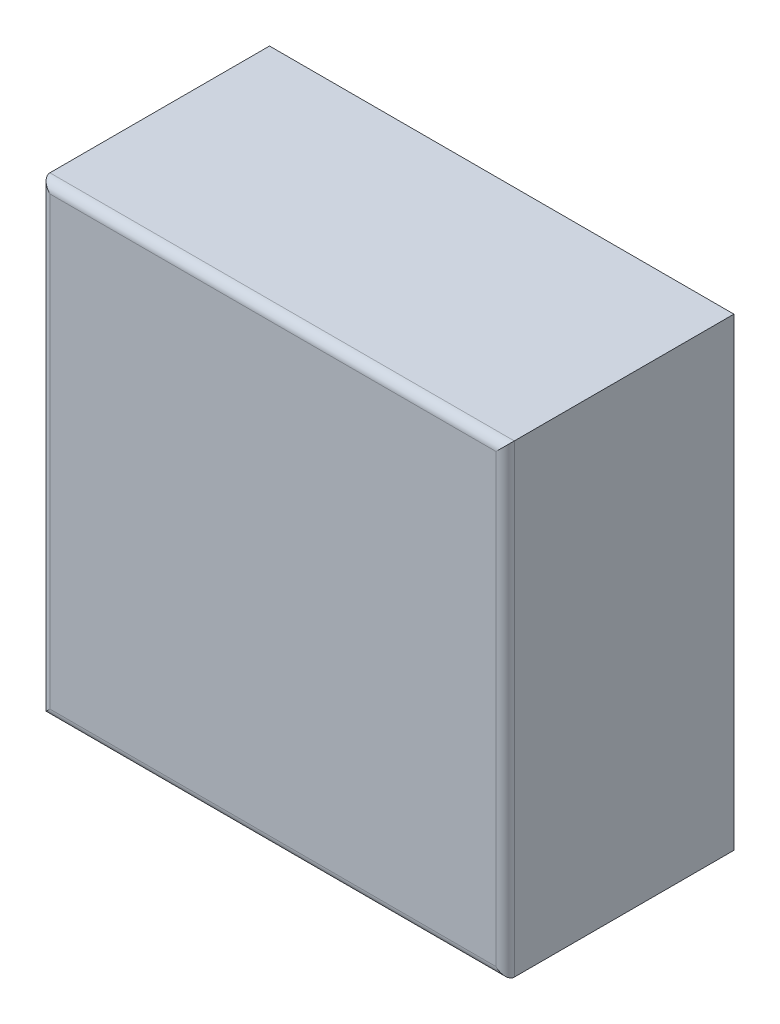
ISO-10303-21;
HEADER;
FILE_DESCRIPTION(('STEP AP214'),'2;1');
FILE_NAME('part.step','',(''),(''),'','','');
FILE_SCHEMA(('AUTOMOTIVE_DESIGN { 1 0 10303 214 1 1 1 1 }'));
ENDSEC;
DATA;
#1=APPLICATION_CONTEXT('core data for automotive mechanical design processes');
#2=APPLICATION_PROTOCOL_DEFINITION('international standard','automotive_design',2000,#1);
#3=PRODUCT_CONTEXT('',#1,'mechanical');
#4=PRODUCT('Part','Part','',(#3));
#5=PRODUCT_RELATED_PRODUCT_CATEGORY('part','',(#4));
#6=PRODUCT_DEFINITION_FORMATION('','',#4);
#7=PRODUCT_DEFINITION_CONTEXT('part definition',#1,'design');
#8=PRODUCT_DEFINITION('design','',#6,#7);
#9=PRODUCT_DEFINITION_SHAPE('','',#8);
#10=(LENGTH_UNIT() NAMED_UNIT(*) SI_UNIT(.MILLI.,.METRE.));
#11=(NAMED_UNIT(*) PLANE_ANGLE_UNIT() SI_UNIT($,.RADIAN.));
#12=(NAMED_UNIT(*) SI_UNIT($,.STERADIAN.) SOLID_ANGLE_UNIT());
#13=UNCERTAINTY_MEASURE_WITH_UNIT(LENGTH_MEASURE(1.E-05),#10,'distance_accuracy_value','');
#14=(GEOMETRIC_REPRESENTATION_CONTEXT(3) GLOBAL_UNCERTAINTY_ASSIGNED_CONTEXT((#13)) GLOBAL_UNIT_ASSIGNED_CONTEXT((#10,
#11,#12)) REPRESENTATION_CONTEXT('',''));
#15=CARTESIAN_POINT('',(0.,0.,0.));
#16=DIRECTION('',(0.,0.,1.));
#17=DIRECTION('',(1.,0.,0.));
#18=AXIS2_PLACEMENT_3D('',#15,#16,#17);
#19=CARTESIAN_POINT('',(-5.075,5.075,5.));
#20=DIRECTION('',(0.,0.,1.));
#21=DIRECTION('',(1.,0.,0.));
#22=AXIS2_PLACEMENT_3D('',#19,#20,#21);
#23=PLANE('',#22);
#24=DIRECTION('',(-1.,0.,0.));
#25=VECTOR('',#24,1.);
#26=CARTESIAN_POINT('',(5.075,-4.875,5.));
#27=LINE('',#26,#25);
#28=CARTESIAN_POINT('',(4.875,-4.875,5.));
#29=VERTEX_POINT('',#28);
#30=CARTESIAN_POINT('',(-4.875,-4.875,5.));
#31=VERTEX_POINT('',#30);
#32=EDGE_CURVE('E68',#29,#31,#27,.T.);
#33=ORIENTED_EDGE('',*,*,#32,.F.);
#34=DIRECTION('',(0.,-1.,0.));
#35=VECTOR('',#34,1.);
#36=CARTESIAN_POINT('',(4.875,5.075,5.));
#37=LINE('',#36,#35);
#38=CARTESIAN_POINT('',(4.875,4.875,5.));
#39=VERTEX_POINT('',#38);
#40=EDGE_CURVE('E89',#39,#29,#37,.T.);
#41=ORIENTED_EDGE('',*,*,#40,.F.);
#42=DIRECTION('',(1.,0.,0.));
#43=VECTOR('',#42,1.);
#44=CARTESIAN_POINT('',(-5.075,4.875,5.));
#45=LINE('',#44,#43);
#46=CARTESIAN_POINT('',(-4.875,4.875,5.));
#47=VERTEX_POINT('',#46);
#48=EDGE_CURVE('E80',#47,#39,#45,.T.);
#49=ORIENTED_EDGE('',*,*,#48,.F.);
#50=DIRECTION('',(0.,1.,0.));
#51=VECTOR('',#50,1.);
#52=CARTESIAN_POINT('',(-4.875,-5.075,5.));
#53=LINE('',#52,#51);
#54=EDGE_CURVE('E77',#31,#47,#53,.T.);
#55=ORIENTED_EDGE('',*,*,#54,.F.);
#56=EDGE_LOOP('',(#33,#41,#49,#55));
#57=FACE_BOUND('',#56,.T.);
#58=ADVANCED_FACE('F17',(#57),#23,.T.);
#59=CARTESIAN_POINT('',(-4.875,-5.075,4.8));
#60=DIRECTION('',(0.,1.,0.));
#61=DIRECTION('',(0.,0.,1.));
#62=AXIS2_PLACEMENT_3D('',#59,#60,#61);
#63=CYLINDRICAL_SURFACE('',#62,0.2);
#64=CARTESIAN_POINT('',(-4.875,4.875,4.8));
#65=DIRECTION('',(0.707106781186547,0.707106781186547,0.));
#66=DIRECTION('',(0.707106781186547,-0.707106781186547,0.));
#67=AXIS2_PLACEMENT_3D('',#64,#65,#66);
#68=ELLIPSE('',#67,0.282842712474619,0.2);
#69=CARTESIAN_POINT('',(-5.075,5.075,4.8));
#70=VERTEX_POINT('',#69);
#71=EDGE_CURVE('E93',#70,#47,#68,.T.);
#72=ORIENTED_EDGE('',*,*,#71,.F.);
#73=DIRECTION('',(0.,1.,0.));
#74=VECTOR('',#73,1.);
#75=CARTESIAN_POINT('',(-5.075,-5.075,4.8));
#76=LINE('',#75,#74);
#77=CARTESIAN_POINT('',(-5.075,-5.075,4.8));
#78=VERTEX_POINT('',#77);
#79=EDGE_CURVE('E87',#78,#70,#76,.T.);
#80=ORIENTED_EDGE('',*,*,#79,.F.);
#81=CARTESIAN_POINT('',(-4.875,-4.875,4.8));
#82=DIRECTION('',(-0.707106781186547,0.707106781186547,0.));
#83=DIRECTION('',(-0.707106781186547,-0.707106781186547,0.));
#84=AXIS2_PLACEMENT_3D('',#81,#82,#83);
#85=ELLIPSE('',#84,0.282842712474619,0.2);
#86=EDGE_CURVE('E20',#31,#78,#85,.F.);
#87=ORIENTED_EDGE('',*,*,#86,.F.);
#88=ORIENTED_EDGE('',*,*,#54,.T.);
#89=EDGE_LOOP('',(#72,#80,#87,#88));
#90=FACE_BOUND('',#89,.T.);
#91=ADVANCED_FACE('F86',(#90),#63,.T.);
#92=CARTESIAN_POINT('',(5.075,-4.875,4.8));
#93=DIRECTION('',(-1.,0.,0.));
#94=DIRECTION('',(0.,0.,1.));
#95=AXIS2_PLACEMENT_3D('',#92,#93,#94);
#96=CYLINDRICAL_SURFACE('',#95,0.2);
#97=ORIENTED_EDGE('',*,*,#86,.T.);
#98=DIRECTION('',(1.,0.,0.));
#99=VECTOR('',#98,1.);
#100=CARTESIAN_POINT('',(5.075,-5.075,4.8));
#101=LINE('',#100,#99);
#102=CARTESIAN_POINT('',(5.075,-5.075,4.8));
#103=VERTEX_POINT('',#102);
#104=EDGE_CURVE('E97',#103,#78,#101,.F.);
#105=ORIENTED_EDGE('',*,*,#104,.F.);
#106=CARTESIAN_POINT('',(4.875,-4.875,4.8));
#107=DIRECTION('',(-0.707106781186547,-0.707106781186547,0.));
#108=DIRECTION('',(0.707106781186547,-0.707106781186547,0.));
#109=AXIS2_PLACEMENT_3D('',#106,#107,#108);
#110=ELLIPSE('',#109,0.282842712474619,0.2);
#111=EDGE_CURVE('E74',#29,#103,#110,.F.);
#112=ORIENTED_EDGE('',*,*,#111,.F.);
#113=ORIENTED_EDGE('',*,*,#32,.T.);
#114=EDGE_LOOP('',(#97,#105,#112,#113));
#115=FACE_BOUND('',#114,.T.);
#116=ADVANCED_FACE('F70',(#115),#96,.T.);
#117=CARTESIAN_POINT('',(4.875,5.075,4.8));
#118=DIRECTION('',(0.,-1.,0.));
#119=DIRECTION('',(0.,0.,-1.));
#120=AXIS2_PLACEMENT_3D('',#117,#118,#119);
#121=CYLINDRICAL_SURFACE('',#120,0.2);
#122=ORIENTED_EDGE('',*,*,#111,.T.);
#123=DIRECTION('',(0.,1.,0.));
#124=VECTOR('',#123,1.);
#125=CARTESIAN_POINT('',(5.075,5.075,4.8));
#126=LINE('',#125,#124);
#127=CARTESIAN_POINT('',(5.075,5.075,4.8));
#128=VERTEX_POINT('',#127);
#129=EDGE_CURVE('E102',#128,#103,#126,.F.);
#130=ORIENTED_EDGE('',*,*,#129,.F.);
#131=CARTESIAN_POINT('',(4.875,4.875,4.8));
#132=DIRECTION('',(0.707106781186547,-0.707106781186547,0.));
#133=DIRECTION('',(0.707106781186547,0.707106781186547,0.));
#134=AXIS2_PLACEMENT_3D('',#131,#132,#133);
#135=ELLIPSE('',#134,0.282842712474619,0.2);
#136=EDGE_CURVE('E105',#39,#128,#135,.F.);
#137=ORIENTED_EDGE('',*,*,#136,.F.);
#138=ORIENTED_EDGE('',*,*,#40,.T.);
#139=EDGE_LOOP('',(#122,#130,#137,#138));
#140=FACE_BOUND('',#139,.T.);
#141=ADVANCED_FACE('F143',(#140),#121,.T.);
#142=CARTESIAN_POINT('',(-5.075,4.875,4.8));
#143=DIRECTION('',(1.,0.,0.));
#144=DIRECTION('',(0.,0.,-1.));
#145=AXIS2_PLACEMENT_3D('',#142,#143,#144);
#146=CYLINDRICAL_SURFACE('',#145,0.2);
#147=ORIENTED_EDGE('',*,*,#136,.T.);
#148=DIRECTION('',(1.,0.,0.));
#149=VECTOR('',#148,1.);
#150=CARTESIAN_POINT('',(-5.075,5.075,4.8));
#151=LINE('',#150,#149);
#152=EDGE_CURVE('E116',#70,#128,#151,.T.);
#153=ORIENTED_EDGE('',*,*,#152,.F.);
#154=ORIENTED_EDGE('',*,*,#71,.T.);
#155=ORIENTED_EDGE('',*,*,#48,.T.);
#156=EDGE_LOOP('',(#147,#153,#154,#155));
#157=FACE_BOUND('',#156,.T.);
#158=ADVANCED_FACE('F142',(#157),#146,.T.);
#159=CARTESIAN_POINT('',(-5.075,-5.075,0.));
#160=DIRECTION('',(-1.,0.,0.));
#161=DIRECTION('',(0.,0.,1.));
#162=AXIS2_PLACEMENT_3D('',#159,#160,#161);
#163=PLANE('',#162);
#164=DIRECTION('',(0.,0.,1.));
#165=VECTOR('',#164,1.);
#166=CARTESIAN_POINT('',(-5.075,5.075,0.));
#167=LINE('',#166,#165);
#168=CARTESIAN_POINT('',(-5.075,5.075,0.));
#169=VERTEX_POINT('',#168);
#170=EDGE_CURVE('E101',#169,#70,#167,.T.);
#171=ORIENTED_EDGE('',*,*,#170,.F.);
#172=DIRECTION('',(0.,1.,0.));
#173=VECTOR('',#172,1.);
#174=CARTESIAN_POINT('',(-5.075,5.075,0.));
#175=LINE('',#174,#173);
#176=CARTESIAN_POINT('',(-5.075,-5.075,0.));
#177=VERTEX_POINT('',#176);
#178=EDGE_CURVE('E123',#169,#177,#175,.F.);
#179=ORIENTED_EDGE('',*,*,#178,.T.);
#180=DIRECTION('',(0.,0.,-1.));
#181=VECTOR('',#180,1.);
#182=CARTESIAN_POINT('',(-5.075,-5.075,0.));
#183=LINE('',#182,#181);
#184=EDGE_CURVE('E99',#78,#177,#183,.T.);
#185=ORIENTED_EDGE('',*,*,#184,.F.);
#186=ORIENTED_EDGE('',*,*,#79,.T.);
#187=EDGE_LOOP('',(#171,#179,#185,#186));
#188=FACE_BOUND('',#187,.T.);
#189=ADVANCED_FACE('F146',(#188),#163,.T.);
#190=CARTESIAN_POINT('',(5.075,-5.075,0.));
#191=DIRECTION('',(0.,-1.,0.));
#192=DIRECTION('',(0.,0.,-1.));
#193=AXIS2_PLACEMENT_3D('',#190,#191,#192);
#194=PLANE('',#193);
#195=ORIENTED_EDGE('',*,*,#184,.T.);
#196=DIRECTION('',(1.,0.,0.));
#197=VECTOR('',#196,1.);
#198=CARTESIAN_POINT('',(-5.075,-5.075,0.));
#199=LINE('',#198,#197);
#200=CARTESIAN_POINT('',(5.075,-5.075,0.));
#201=VERTEX_POINT('',#200);
#202=EDGE_CURVE('E112',#177,#201,#199,.T.);
#203=ORIENTED_EDGE('',*,*,#202,.T.);
#204=DIRECTION('',(0.,0.,-1.));
#205=VECTOR('',#204,1.);
#206=CARTESIAN_POINT('',(5.075,-5.075,0.));
#207=LINE('',#206,#205);
#208=EDGE_CURVE('E100',#103,#201,#207,.T.);
#209=ORIENTED_EDGE('',*,*,#208,.F.);
#210=ORIENTED_EDGE('',*,*,#104,.T.);
#211=EDGE_LOOP('',(#195,#203,#209,#210));
#212=FACE_BOUND('',#211,.T.);
#213=ADVANCED_FACE('F144',(#212),#194,.T.);
#214=CARTESIAN_POINT('',(5.075,5.075,0.));
#215=DIRECTION('',(1.,0.,0.));
#216=DIRECTION('',(0.,0.,-1.));
#217=AXIS2_PLACEMENT_3D('',#214,#215,#216);
#218=PLANE('',#217);
#219=ORIENTED_EDGE('',*,*,#208,.T.);
#220=DIRECTION('',(0.,1.,0.));
#221=VECTOR('',#220,1.);
#222=CARTESIAN_POINT('',(5.075,5.075,0.));
#223=LINE('',#222,#221);
#224=CARTESIAN_POINT('',(5.075,5.075,0.));
#225=VERTEX_POINT('',#224);
#226=EDGE_CURVE('E26',#201,#225,#223,.T.);
#227=ORIENTED_EDGE('',*,*,#226,.T.);
#228=DIRECTION('',(0.,0.,1.));
#229=VECTOR('',#228,1.);
#230=CARTESIAN_POINT('',(5.075,5.075,0.));
#231=LINE('',#230,#229);
#232=EDGE_CURVE('E34',#128,#225,#231,.F.);
#233=ORIENTED_EDGE('',*,*,#232,.F.);
#234=ORIENTED_EDGE('',*,*,#129,.T.);
#235=EDGE_LOOP('',(#219,#227,#233,#234));
#236=FACE_BOUND('',#235,.T.);
#237=ADVANCED_FACE('F137',(#236),#218,.T.);
#238=CARTESIAN_POINT('',(-5.075,5.075,0.));
#239=DIRECTION('',(0.,1.,0.));
#240=DIRECTION('',(0.,0.,1.));
#241=AXIS2_PLACEMENT_3D('',#238,#239,#240);
#242=PLANE('',#241);
#243=ORIENTED_EDGE('',*,*,#232,.T.);
#244=DIRECTION('',(1.,0.,0.));
#245=VECTOR('',#244,1.);
#246=CARTESIAN_POINT('',(-5.075,5.075,0.));
#247=LINE('',#246,#245);
#248=EDGE_CURVE('E11',#225,#169,#247,.F.);
#249=ORIENTED_EDGE('',*,*,#248,.T.);
#250=ORIENTED_EDGE('',*,*,#170,.T.);
#251=ORIENTED_EDGE('',*,*,#152,.T.);
#252=EDGE_LOOP('',(#243,#249,#250,#251));
#253=FACE_BOUND('',#252,.T.);
#254=ADVANCED_FACE('F140',(#253),#242,.T.);
#255=CARTESIAN_POINT('',(-5.075,5.075,0.));
#256=DIRECTION('',(0.,0.,1.));
#257=DIRECTION('',(1.,0.,0.));
#258=AXIS2_PLACEMENT_3D('',#255,#256,#257);
#259=PLANE('',#258);
#260=ORIENTED_EDGE('',*,*,#226,.F.);
#261=ORIENTED_EDGE('',*,*,#202,.F.);
#262=ORIENTED_EDGE('',*,*,#178,.F.);
#263=ORIENTED_EDGE('',*,*,#248,.F.);
#264=EDGE_LOOP('',(#260,#261,#262,#263));
#265=FACE_BOUND('',#264,.T.);
#266=ADVANCED_FACE('F139',(#265),#259,.F.);
#267=CLOSED_SHELL('',(#58,#91,#116,#141,#158,#189,#213,#237,#254,#266));
#268=MANIFOLD_SOLID_BREP('B1',#267);
#269=ADVANCED_BREP_SHAPE_REPRESENTATION('',(#18,#268),#14);
#270=SHAPE_DEFINITION_REPRESENTATION(#9,#269);
ENDSEC;
END-ISO-10303-21;
